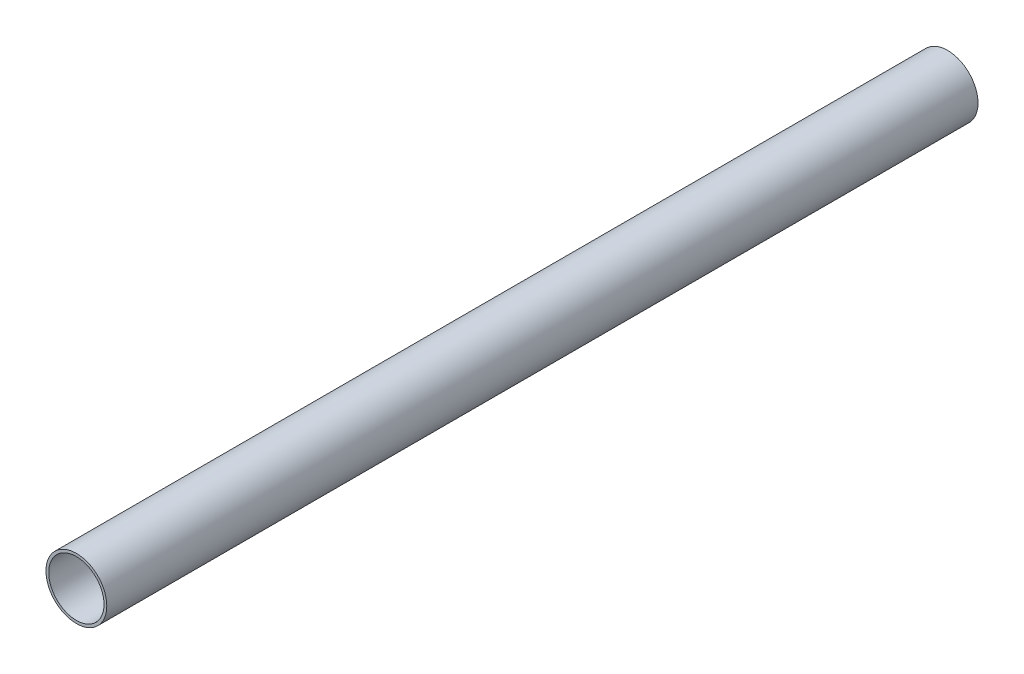
ISO-10303-21;
HEADER;
FILE_DESCRIPTION(('STEP AP214'),'2;1');
FILE_NAME('part.step','',(''),(''),'','','');
FILE_SCHEMA(('AUTOMOTIVE_DESIGN { 1 0 10303 214 1 1 1 1 }'));
ENDSEC;
DATA;
#1=APPLICATION_CONTEXT('core data for automotive mechanical design processes');
#2=APPLICATION_PROTOCOL_DEFINITION('international standard','automotive_design',2000,#1);
#3=PRODUCT_CONTEXT('',#1,'mechanical');
#4=PRODUCT('Part','Part','',(#3));
#5=PRODUCT_RELATED_PRODUCT_CATEGORY('part','',(#4));
#6=PRODUCT_DEFINITION_FORMATION('','',#4);
#7=PRODUCT_DEFINITION_CONTEXT('part definition',#1,'design');
#8=PRODUCT_DEFINITION('design','',#6,#7);
#9=PRODUCT_DEFINITION_SHAPE('','',#8);
#10=(LENGTH_UNIT() NAMED_UNIT(*) SI_UNIT(.MILLI.,.METRE.));
#11=(NAMED_UNIT(*) PLANE_ANGLE_UNIT() SI_UNIT($,.RADIAN.));
#12=(NAMED_UNIT(*) SI_UNIT($,.STERADIAN.) SOLID_ANGLE_UNIT());
#13=UNCERTAINTY_MEASURE_WITH_UNIT(LENGTH_MEASURE(1.E-05),#10,'distance_accuracy_value','');
#14=(GEOMETRIC_REPRESENTATION_CONTEXT(3) GLOBAL_UNCERTAINTY_ASSIGNED_CONTEXT((#13)) GLOBAL_UNIT_ASSIGNED_CONTEXT((#10,
#11,#12)) REPRESENTATION_CONTEXT('',''));
#15=CARTESIAN_POINT('',(0.,0.,0.));
#16=DIRECTION('',(0.,0.,1.));
#17=DIRECTION('',(1.,0.,0.));
#18=AXIS2_PLACEMENT_3D('',#15,#16,#17);
#19=CARTESIAN_POINT('',(0.,0.,157.5));
#20=DIRECTION('',(0.,0.,1.));
#21=DIRECTION('',(1.,0.,0.));
#22=AXIS2_PLACEMENT_3D('',#19,#20,#21);
#23=PLANE('',#22);
#24=CARTESIAN_POINT('',(0.,0.,157.5));
#25=DIRECTION('',(0.,0.,1.));
#26=DIRECTION('',(1.,0.,0.));
#27=AXIS2_PLACEMENT_3D('',#24,#25,#26);
#28=CIRCLE('',#27,11.);
#29=CARTESIAN_POINT('',(11.,0.,157.5));
#30=VERTEX_POINT('',#29);
#31=EDGE_CURVE('E10',#30,#30,#28,.T.);
#32=ORIENTED_EDGE('',*,*,#31,.T.);
#33=EDGE_LOOP('',(#32));
#34=FACE_BOUND('',#33,.T.);
#35=CARTESIAN_POINT('',(0.,0.,157.5));
#36=DIRECTION('',(0.,0.,1.));
#37=DIRECTION('',(1.,0.,0.));
#38=AXIS2_PLACEMENT_3D('',#35,#36,#37);
#39=CIRCLE('',#38,10.);
#40=CARTESIAN_POINT('',(10.,0.,157.5));
#41=VERTEX_POINT('',#40);
#42=EDGE_CURVE('E44',#41,#41,#39,.T.);
#43=ORIENTED_EDGE('',*,*,#42,.F.);
#44=EDGE_LOOP('',(#43));
#45=FACE_BOUND('',#44,.T.);
#46=ADVANCED_FACE('F33',(#34,#45),#23,.T.);
#47=CARTESIAN_POINT('',(0.,0.,-157.5));
#48=DIRECTION('',(0.,0.,1.));
#49=DIRECTION('',(1.,0.,0.));
#50=AXIS2_PLACEMENT_3D('',#47,#48,#49);
#51=PLANE('',#50);
#52=CARTESIAN_POINT('',(0.,0.,-157.5));
#53=DIRECTION('',(0.,0.,1.));
#54=DIRECTION('',(1.,0.,0.));
#55=AXIS2_PLACEMENT_3D('',#52,#53,#54);
#56=CIRCLE('',#55,11.);
#57=CARTESIAN_POINT('',(11.,0.,-157.5));
#58=VERTEX_POINT('',#57);
#59=EDGE_CURVE('E37',#58,#58,#56,.T.);
#60=ORIENTED_EDGE('',*,*,#59,.F.);
#61=EDGE_LOOP('',(#60));
#62=FACE_BOUND('',#61,.T.);
#63=CARTESIAN_POINT('',(0.,0.,-157.5));
#64=DIRECTION('',(0.,0.,1.));
#65=DIRECTION('',(1.,0.,0.));
#66=AXIS2_PLACEMENT_3D('',#63,#64,#65);
#67=CIRCLE('',#66,10.);
#68=CARTESIAN_POINT('',(10.,0.,-157.5));
#69=VERTEX_POINT('',#68);
#70=EDGE_CURVE('E46',#69,#69,#67,.T.);
#71=ORIENTED_EDGE('',*,*,#70,.T.);
#72=EDGE_LOOP('',(#71));
#73=FACE_BOUND('',#72,.T.);
#74=ADVANCED_FACE('F56',(#62,#73),#51,.F.);
#75=CARTESIAN_POINT('',(0.,0.,157.5));
#76=DIRECTION('',(0.,0.,-1.));
#77=DIRECTION('',(-1.,0.,0.));
#78=AXIS2_PLACEMENT_3D('',#75,#76,#77);
#79=CYLINDRICAL_SURFACE('',#78,11.);
#80=ORIENTED_EDGE('',*,*,#31,.F.);
#81=EDGE_LOOP('',(#80));
#82=FACE_BOUND('',#81,.T.);
#83=ORIENTED_EDGE('',*,*,#59,.T.);
#84=EDGE_LOOP('',(#83));
#85=FACE_BOUND('',#84,.T.);
#86=ADVANCED_FACE('F35',(#82,#85),#79,.T.);
#87=CARTESIAN_POINT('',(0.,0.,157.5));
#88=DIRECTION('',(0.,0.,-1.));
#89=DIRECTION('',(-1.,0.,0.));
#90=AXIS2_PLACEMENT_3D('',#87,#88,#89);
#91=CYLINDRICAL_SURFACE('',#90,10.);
#92=ORIENTED_EDGE('',*,*,#42,.T.);
#93=EDGE_LOOP('',(#92));
#94=FACE_BOUND('',#93,.T.);
#95=ORIENTED_EDGE('',*,*,#70,.F.);
#96=EDGE_LOOP('',(#95));
#97=FACE_BOUND('',#96,.T.);
#98=ADVANCED_FACE('F52',(#94,#97),#91,.F.);
#99=CLOSED_SHELL('',(#46,#74,#86,#98));
#100=MANIFOLD_SOLID_BREP('B2',#99);
#101=ADVANCED_BREP_SHAPE_REPRESENTATION('',(#18,#100),#14);
#102=SHAPE_DEFINITION_REPRESENTATION(#9,#101);
ENDSEC;
END-ISO-10303-21;
